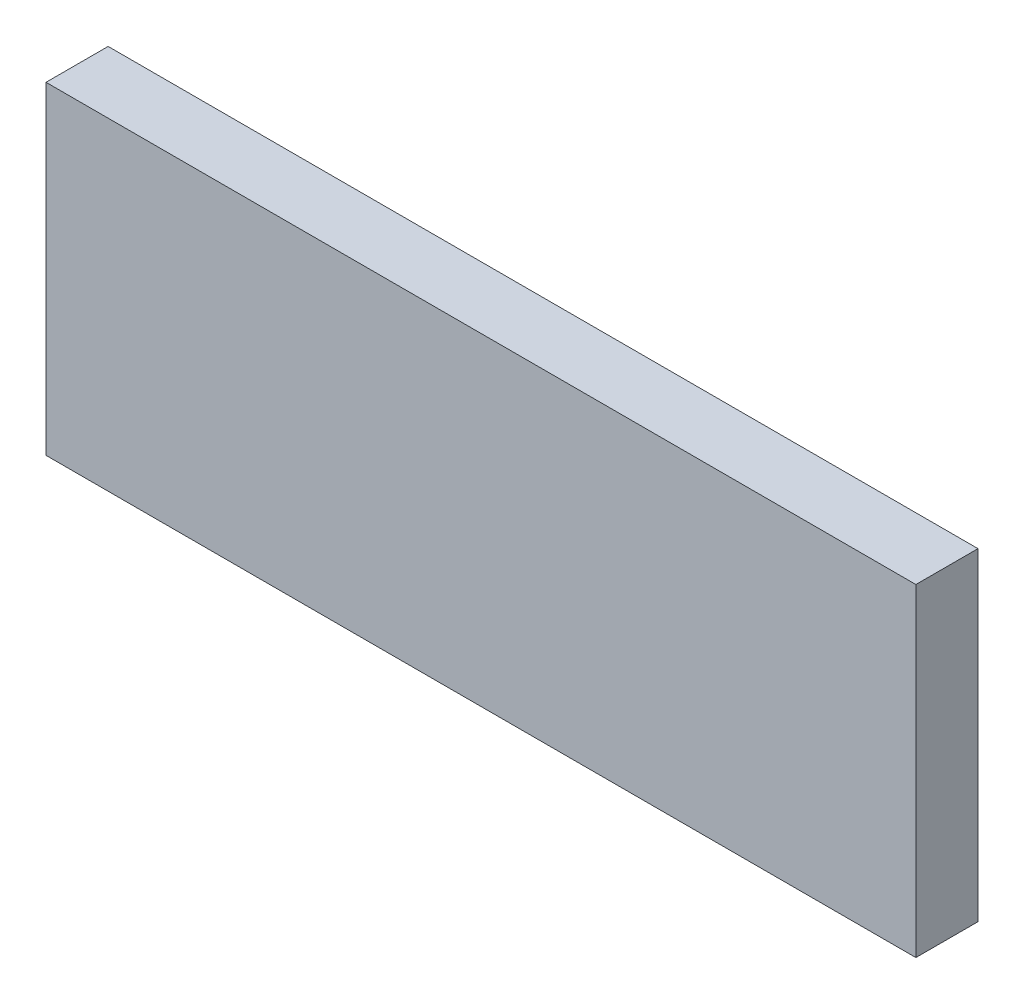
ISO-10303-21;
HEADER;
FILE_DESCRIPTION(('STEP AP214'),'2;1');
FILE_NAME('part.step','',(''),(''),'','','');
FILE_SCHEMA(('AUTOMOTIVE_DESIGN { 1 0 10303 214 1 1 1 1 }'));
ENDSEC;
DATA;
#1=APPLICATION_CONTEXT('core data for automotive mechanical design processes');
#2=APPLICATION_PROTOCOL_DEFINITION('international standard','automotive_design',2000,#1);
#3=PRODUCT_CONTEXT('',#1,'mechanical');
#4=PRODUCT('Part','Part','',(#3));
#5=PRODUCT_RELATED_PRODUCT_CATEGORY('part','',(#4));
#6=PRODUCT_DEFINITION_FORMATION('','',#4);
#7=PRODUCT_DEFINITION_CONTEXT('part definition',#1,'design');
#8=PRODUCT_DEFINITION('design','',#6,#7);
#9=PRODUCT_DEFINITION_SHAPE('','',#8);
#10=(LENGTH_UNIT() NAMED_UNIT(*) SI_UNIT(.MILLI.,.METRE.));
#11=(NAMED_UNIT(*) PLANE_ANGLE_UNIT() SI_UNIT($,.RADIAN.));
#12=(NAMED_UNIT(*) SI_UNIT($,.STERADIAN.) SOLID_ANGLE_UNIT());
#13=UNCERTAINTY_MEASURE_WITH_UNIT(LENGTH_MEASURE(1.E-05),#10,'distance_accuracy_value','');
#14=(GEOMETRIC_REPRESENTATION_CONTEXT(3) GLOBAL_UNCERTAINTY_ASSIGNED_CONTEXT((#13)) GLOBAL_UNIT_ASSIGNED_CONTEXT((#10,
#11,#12)) REPRESENTATION_CONTEXT('',''));
#15=CARTESIAN_POINT('',(0.,0.,0.));
#16=DIRECTION('',(0.,0.,1.));
#17=DIRECTION('',(1.,0.,0.));
#18=AXIS2_PLACEMENT_3D('',#15,#16,#17);
#19=CARTESIAN_POINT('',(0.,6.5,-10.));
#20=DIRECTION('',(0.,-1.,0.));
#21=DIRECTION('',(0.,0.,-1.));
#22=AXIS2_PLACEMENT_3D('',#19,#20,#21);
#23=PLANE('',#22);
#24=DIRECTION('',(-1.,0.,0.));
#25=VECTOR('',#24,1.);
#26=CARTESIAN_POINT('',(35.,6.5,10.));
#27=LINE('',#26,#25);
#28=CARTESIAN_POINT('',(35.,6.5,10.));
#29=VERTEX_POINT('',#28);
#30=CARTESIAN_POINT('',(0.,6.5,10.));
#31=VERTEX_POINT('',#30);
#32=EDGE_CURVE('E42',#29,#31,#27,.T.);
#33=ORIENTED_EDGE('',*,*,#32,.T.);
#34=DIRECTION('',(0.,0.,1.));
#35=VECTOR('',#34,1.);
#36=CARTESIAN_POINT('',(0.,6.5,0.));
#37=LINE('',#36,#35);
#38=CARTESIAN_POINT('',(0.,6.5,12.5));
#39=VERTEX_POINT('',#38);
#40=EDGE_CURVE('E90',#31,#39,#37,.T.);
#41=ORIENTED_EDGE('',*,*,#40,.T.);
#42=DIRECTION('',(-1.,0.,0.));
#43=VECTOR('',#42,1.);
#44=CARTESIAN_POINT('',(35.,6.5,12.5));
#45=LINE('',#44,#43);
#46=CARTESIAN_POINT('',(35.,6.5,12.5));
#47=VERTEX_POINT('',#46);
#48=EDGE_CURVE('E87',#47,#39,#45,.T.);
#49=ORIENTED_EDGE('',*,*,#48,.F.);
#50=DIRECTION('',(0.,0.,1.));
#51=VECTOR('',#50,1.);
#52=CARTESIAN_POINT('',(35.,6.5,0.));
#53=LINE('',#52,#51);
#54=EDGE_CURVE('E84',#29,#47,#53,.T.);
#55=ORIENTED_EDGE('',*,*,#54,.F.);
#56=EDGE_LOOP('',(#33,#41,#49,#55));
#57=FACE_BOUND('',#56,.T.);
#58=ADVANCED_FACE('F39',(#57),#23,.F.);
#59=CARTESIAN_POINT('',(0.,-6.5,10.));
#60=DIRECTION('',(0.,1.,0.));
#61=DIRECTION('',(0.,0.,1.));
#62=AXIS2_PLACEMENT_3D('',#59,#60,#61);
#63=PLANE('',#62);
#64=DIRECTION('',(1.,0.,0.));
#65=VECTOR('',#64,1.);
#66=CARTESIAN_POINT('',(35.,-6.5,12.5));
#67=LINE('',#66,#65);
#68=CARTESIAN_POINT('',(0.,-6.5,12.5));
#69=VERTEX_POINT('',#68);
#70=CARTESIAN_POINT('',(35.,-6.5,12.5));
#71=VERTEX_POINT('',#70);
#72=EDGE_CURVE('E103',#69,#71,#67,.T.);
#73=ORIENTED_EDGE('',*,*,#72,.F.);
#74=DIRECTION('',(0.,0.,-1.));
#75=VECTOR('',#74,1.);
#76=CARTESIAN_POINT('',(0.,-6.5,0.));
#77=LINE('',#76,#75);
#78=CARTESIAN_POINT('',(0.,-6.5,10.));
#79=VERTEX_POINT('',#78);
#80=EDGE_CURVE('E94',#69,#79,#77,.T.);
#81=ORIENTED_EDGE('',*,*,#80,.T.);
#82=DIRECTION('',(-1.,0.,0.));
#83=VECTOR('',#82,1.);
#84=CARTESIAN_POINT('',(35.,-6.5,10.));
#85=LINE('',#84,#83);
#86=CARTESIAN_POINT('',(35.,-6.5,10.));
#87=VERTEX_POINT('',#86);
#88=EDGE_CURVE('E56',#87,#79,#85,.T.);
#89=ORIENTED_EDGE('',*,*,#88,.F.);
#90=DIRECTION('',(0.,0.,-1.));
#91=VECTOR('',#90,1.);
#92=CARTESIAN_POINT('',(35.,-6.5,0.));
#93=LINE('',#92,#91);
#94=EDGE_CURVE('E64',#71,#87,#93,.T.);
#95=ORIENTED_EDGE('',*,*,#94,.F.);
#96=EDGE_LOOP('',(#73,#81,#89,#95));
#97=FACE_BOUND('',#96,.T.);
#98=ADVANCED_FACE('F119',(#97),#63,.F.);
#99=CARTESIAN_POINT('',(35.,0.,0.));
#100=DIRECTION('',(-1.,0.,0.));
#101=DIRECTION('',(0.,0.,1.));
#102=AXIS2_PLACEMENT_3D('',#99,#100,#101);
#103=PLANE('',#102);
#104=DIRECTION('',(0.,-1.,0.));
#105=VECTOR('',#104,1.);
#106=CARTESIAN_POINT('',(35.,0.,10.));
#107=LINE('',#106,#105);
#108=EDGE_CURVE('E48',#29,#87,#107,.T.);
#109=ORIENTED_EDGE('',*,*,#108,.F.);
#110=ORIENTED_EDGE('',*,*,#54,.T.);
#111=DIRECTION('',(0.,-1.,0.));
#112=VECTOR('',#111,1.);
#113=CARTESIAN_POINT('',(35.,-9.,12.5));
#114=LINE('',#113,#112);
#115=EDGE_CURVE('E107',#47,#71,#114,.T.);
#116=ORIENTED_EDGE('',*,*,#115,.T.);
#117=ORIENTED_EDGE('',*,*,#94,.T.);
#118=EDGE_LOOP('',(#109,#110,#116,#117));
#119=FACE_BOUND('',#118,.T.);
#120=ADVANCED_FACE('F95',(#119),#103,.F.);
#121=CARTESIAN_POINT('',(0.,0.,0.));
#122=DIRECTION('',(-1.,0.,0.));
#123=DIRECTION('',(0.,0.,1.));
#124=AXIS2_PLACEMENT_3D('',#121,#122,#123);
#125=PLANE('',#124);
#126=ORIENTED_EDGE('',*,*,#40,.F.);
#127=DIRECTION('',(0.,-1.,0.));
#128=VECTOR('',#127,1.);
#129=CARTESIAN_POINT('',(0.,0.,10.));
#130=LINE('',#129,#128);
#131=EDGE_CURVE('E11',#31,#79,#130,.T.);
#132=ORIENTED_EDGE('',*,*,#131,.T.);
#133=ORIENTED_EDGE('',*,*,#80,.F.);
#134=DIRECTION('',(0.,-1.,0.));
#135=VECTOR('',#134,1.);
#136=CARTESIAN_POINT('',(0.,-9.,12.5));
#137=LINE('',#136,#135);
#138=EDGE_CURVE('E99',#39,#69,#137,.T.);
#139=ORIENTED_EDGE('',*,*,#138,.F.);
#140=EDGE_LOOP('',(#126,#132,#133,#139));
#141=FACE_BOUND('',#140,.T.);
#142=ADVANCED_FACE('F122',(#141),#125,.T.);
#143=CARTESIAN_POINT('',(35.,-9.,10.));
#144=DIRECTION('',(0.,0.,-1.));
#145=DIRECTION('',(-1.,0.,0.));
#146=AXIS2_PLACEMENT_3D('',#143,#144,#145);
#147=PLANE('',#146);
#148=ORIENTED_EDGE('',*,*,#131,.F.);
#149=ORIENTED_EDGE('',*,*,#32,.F.);
#150=ORIENTED_EDGE('',*,*,#108,.T.);
#151=ORIENTED_EDGE('',*,*,#88,.T.);
#152=EDGE_LOOP('',(#148,#149,#150,#151));
#153=FACE_BOUND('',#152,.T.);
#154=ADVANCED_FACE('F92',(#153),#147,.T.);
#155=CARTESIAN_POINT('',(35.,-9.,12.5));
#156=DIRECTION('',(0.,0.,-1.));
#157=DIRECTION('',(-1.,0.,0.));
#158=AXIS2_PLACEMENT_3D('',#155,#156,#157);
#159=PLANE('',#158);
#160=ORIENTED_EDGE('',*,*,#115,.F.);
#161=ORIENTED_EDGE('',*,*,#48,.T.);
#162=ORIENTED_EDGE('',*,*,#138,.T.);
#163=ORIENTED_EDGE('',*,*,#72,.T.);
#164=EDGE_LOOP('',(#160,#161,#162,#163));
#165=FACE_BOUND('',#164,.T.);
#166=ADVANCED_FACE('F124',(#165),#159,.F.);
#167=CLOSED_SHELL('',(#58,#98,#120,#142,#154,#166));
#168=MANIFOLD_SOLID_BREP('B2',#167);
#169=ADVANCED_BREP_SHAPE_REPRESENTATION('',(#18,#168),#14);
#170=SHAPE_DEFINITION_REPRESENTATION(#9,#169);
ENDSEC;
END-ISO-10303-21;
